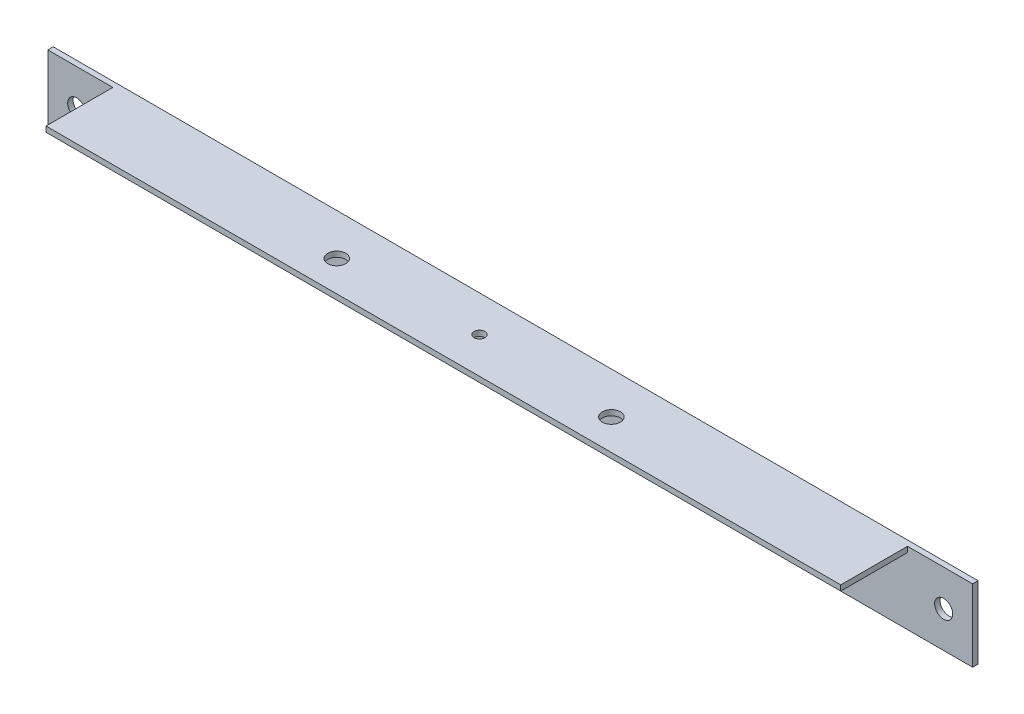
ISO-10303-21;
HEADER;
FILE_DESCRIPTION(('STEP AP214'),'2;1');
FILE_NAME('part.step','',(''),(''),'','','');
FILE_SCHEMA(('AUTOMOTIVE_DESIGN { 1 0 10303 214 1 1 1 1 }'));
ENDSEC;
DATA;
#1=APPLICATION_CONTEXT('core data for automotive mechanical design processes');
#2=APPLICATION_PROTOCOL_DEFINITION('international standard','automotive_design',2000,#1);
#3=PRODUCT_CONTEXT('',#1,'mechanical');
#4=PRODUCT('Part','Part','',(#3));
#5=PRODUCT_RELATED_PRODUCT_CATEGORY('part','',(#4));
#6=PRODUCT_DEFINITION_FORMATION('','',#4);
#7=PRODUCT_DEFINITION_CONTEXT('part definition',#1,'design');
#8=PRODUCT_DEFINITION('design','',#6,#7);
#9=PRODUCT_DEFINITION_SHAPE('','',#8);
#10=(LENGTH_UNIT() NAMED_UNIT(*) SI_UNIT(.MILLI.,.METRE.));
#11=(NAMED_UNIT(*) PLANE_ANGLE_UNIT() SI_UNIT($,.RADIAN.));
#12=(NAMED_UNIT(*) SI_UNIT($,.STERADIAN.) SOLID_ANGLE_UNIT());
#13=UNCERTAINTY_MEASURE_WITH_UNIT(LENGTH_MEASURE(1.E-05),#10,'distance_accuracy_value','');
#14=(GEOMETRIC_REPRESENTATION_CONTEXT(3) GLOBAL_UNCERTAINTY_ASSIGNED_CONTEXT((#13)) GLOBAL_UNIT_ASSIGNED_CONTEXT((#10,
#11,#12)) REPRESENTATION_CONTEXT('',''));
#15=CARTESIAN_POINT('',(0.,0.,0.));
#16=DIRECTION('',(0.,0.,1.));
#17=DIRECTION('',(1.,0.,0.));
#18=AXIS2_PLACEMENT_3D('',#15,#16,#17);
#19=CARTESIAN_POINT('',(128.,0.,1.5));
#20=DIRECTION('',(0.,0.,-1.));
#21=DIRECTION('',(0.,1.,0.));
#22=AXIS2_PLACEMENT_3D('',#19,#20,#21);
#23=PLANE('',#22);
#24=CARTESIAN_POINT('',(20.,-10.,1.5));
#25=DIRECTION('',(0.,0.,-1.));
#26=DIRECTION('',(0.,1.,0.));
#27=AXIS2_PLACEMENT_3D('',#24,#25,#26);
#28=CIRCLE('',#27,1.5);
#29=CARTESIAN_POINT('',(20.,-8.5,1.5));
#30=VERTEX_POINT('',#29);
#31=EDGE_CURVE('E226',#30,#30,#28,.T.);
#32=ORIENTED_EDGE('',*,*,#31,.T.);
#33=EDGE_LOOP('',(#32));
#34=FACE_BOUND('',#33,.T.);
#35=CARTESIAN_POINT('',(-20.,-10.,1.5));
#36=DIRECTION('',(0.,0.,-1.));
#37=DIRECTION('',(0.,1.,0.));
#38=AXIS2_PLACEMENT_3D('',#35,#36,#37);
#39=CIRCLE('',#38,1.5);
#40=CARTESIAN_POINT('',(-20.,-8.5,1.5));
#41=VERTEX_POINT('',#40);
#42=EDGE_CURVE('E229',#41,#41,#39,.T.);
#43=ORIENTED_EDGE('',*,*,#42,.T.);
#44=EDGE_LOOP('',(#43));
#45=FACE_BOUND('',#44,.T.);
#46=CARTESIAN_POINT('',(120.,-9.99999999999995,1.5));
#47=DIRECTION('',(0.,0.,1.));
#48=DIRECTION('',(-1.,0.,0.));
#49=AXIS2_PLACEMENT_3D('',#46,#47,#48);
#50=CIRCLE('',#49,2.5);
#51=CARTESIAN_POINT('',(117.5,-9.99999999999995,1.5));
#52=VERTEX_POINT('',#51);
#53=EDGE_CURVE('E145',#52,#52,#50,.T.);
#54=ORIENTED_EDGE('',*,*,#53,.F.);
#55=EDGE_LOOP('',(#54));
#56=FACE_BOUND('',#55,.T.);
#57=CARTESIAN_POINT('',(-120.,-9.99999999999995,1.5));
#58=DIRECTION('',(0.,0.,1.));
#59=DIRECTION('',(1.,0.,0.));
#60=AXIS2_PLACEMENT_3D('',#57,#58,#59);
#61=CIRCLE('',#60,2.5);
#62=CARTESIAN_POINT('',(-117.5,-9.99999999999995,1.5));
#63=VERTEX_POINT('',#62);
#64=EDGE_CURVE('E142',#63,#63,#61,.T.);
#65=ORIENTED_EDGE('',*,*,#64,.F.);
#66=EDGE_LOOP('',(#65));
#67=FACE_BOUND('',#66,.T.);
#68=DIRECTION('',(0.,-1.,0.));
#69=VECTOR('',#68,1.);
#70=CARTESIAN_POINT('',(-128.,0.,1.5));
#71=LINE('',#70,#69);
#72=CARTESIAN_POINT('',(-128.,0.,1.5));
#73=VERTEX_POINT('',#72);
#74=CARTESIAN_POINT('',(-128.,-20.,1.5));
#75=VERTEX_POINT('',#74);
#76=EDGE_CURVE('E48',#73,#75,#71,.T.);
#77=ORIENTED_EDGE('',*,*,#76,.T.);
#78=DIRECTION('',(-1.,0.,0.));
#79=VECTOR('',#78,1.);
#80=CARTESIAN_POINT('',(128.,-20.,1.5));
#81=LINE('',#80,#79);
#82=CARTESIAN_POINT('',(128.,-20.,1.5));
#83=VERTEX_POINT('',#82);
#84=EDGE_CURVE('E11',#83,#75,#81,.T.);
#85=ORIENTED_EDGE('',*,*,#84,.F.);
#86=DIRECTION('',(0.,-1.,0.));
#87=VECTOR('',#86,1.);
#88=CARTESIAN_POINT('',(128.,0.,1.5));
#89=LINE('',#88,#87);
#90=CARTESIAN_POINT('',(128.,0.,1.5));
#91=VERTEX_POINT('',#90);
#92=EDGE_CURVE('E77',#91,#83,#89,.T.);
#93=ORIENTED_EDGE('',*,*,#92,.F.);
#94=DIRECTION('',(-1.,0.,0.));
#95=VECTOR('',#94,1.);
#96=CARTESIAN_POINT('',(128.,0.,1.5));
#97=LINE('',#96,#95);
#98=CARTESIAN_POINT('',(110.,0.,1.5));
#99=VERTEX_POINT('',#98);
#100=EDGE_CURVE('E191',#91,#99,#97,.T.);
#101=ORIENTED_EDGE('',*,*,#100,.T.);
#102=DIRECTION('',(0.,-1.,0.));
#103=VECTOR('',#102,1.);
#104=CARTESIAN_POINT('',(110.,8.5,1.5));
#105=LINE('',#104,#103);
#106=CARTESIAN_POINT('',(110.,-1.5,1.5));
#107=VERTEX_POINT('',#106);
#108=EDGE_CURVE('E118',#99,#107,#105,.T.);
#109=ORIENTED_EDGE('',*,*,#108,.T.);
#110=DIRECTION('',(-1.,0.,0.));
#111=VECTOR('',#110,1.);
#112=CARTESIAN_POINT('',(128.,-1.5,1.5));
#113=LINE('',#112,#111);
#114=CARTESIAN_POINT('',(-110.,-1.5,1.5));
#115=VERTEX_POINT('',#114);
#116=EDGE_CURVE('E125',#107,#115,#113,.T.);
#117=ORIENTED_EDGE('',*,*,#116,.T.);
#118=DIRECTION('',(0.,-1.,0.));
#119=VECTOR('',#118,1.);
#120=CARTESIAN_POINT('',(-110.,8.5,1.5));
#121=LINE('',#120,#119);
#122=CARTESIAN_POINT('',(-110.,0.,1.5));
#123=VERTEX_POINT('',#122);
#124=EDGE_CURVE('E185',#123,#115,#121,.T.);
#125=ORIENTED_EDGE('',*,*,#124,.F.);
#126=DIRECTION('',(-1.,0.,0.));
#127=VECTOR('',#126,1.);
#128=CARTESIAN_POINT('',(128.,0.,1.5));
#129=LINE('',#128,#127);
#130=EDGE_CURVE('E183',#123,#73,#129,.T.);
#131=ORIENTED_EDGE('',*,*,#130,.T.);
#132=EDGE_LOOP('',(#77,#85,#93,#101,#109,#117,#125,#131));
#133=FACE_BOUND('',#132,.T.);
#134=ADVANCED_FACE('F32',(#34,#45,#56,#67,#133),#23,.F.);
#135=CARTESIAN_POINT('',(128.,-20.,0.));
#136=DIRECTION('',(0.,-1.,0.));
#137=DIRECTION('',(0.,0.,-1.));
#138=AXIS2_PLACEMENT_3D('',#135,#136,#137);
#139=PLANE('',#138);
#140=DIRECTION('',(0.,0.,1.));
#141=VECTOR('',#140,1.);
#142=CARTESIAN_POINT('',(-128.,-20.,0.));
#143=LINE('',#142,#141);
#144=CARTESIAN_POINT('',(-128.,-20.,0.));
#145=VERTEX_POINT('',#144);
#146=EDGE_CURVE('E169',#145,#75,#143,.T.);
#147=ORIENTED_EDGE('',*,*,#146,.F.);
#148=DIRECTION('',(-1.,0.,0.));
#149=VECTOR('',#148,1.);
#150=CARTESIAN_POINT('',(128.,-20.,0.));
#151=LINE('',#150,#149);
#152=CARTESIAN_POINT('',(128.,-20.,0.));
#153=VERTEX_POINT('',#152);
#154=EDGE_CURVE('E40',#153,#145,#151,.T.);
#155=ORIENTED_EDGE('',*,*,#154,.F.);
#156=DIRECTION('',(0.,0.,1.));
#157=VECTOR('',#156,1.);
#158=CARTESIAN_POINT('',(128.,-20.,0.));
#159=LINE('',#158,#157);
#160=EDGE_CURVE('E161',#153,#83,#159,.T.);
#161=ORIENTED_EDGE('',*,*,#160,.T.);
#162=ORIENTED_EDGE('',*,*,#84,.T.);
#163=EDGE_LOOP('',(#147,#155,#161,#162));
#164=FACE_BOUND('',#163,.T.);
#165=ADVANCED_FACE('F179',(#164),#139,.T.);
#166=CARTESIAN_POINT('',(128.,0.,0.));
#167=DIRECTION('',(0.,0.,-1.));
#168=DIRECTION('',(0.,1.,0.));
#169=AXIS2_PLACEMENT_3D('',#166,#167,#168);
#170=PLANE('',#169);
#171=CARTESIAN_POINT('',(20.,-10.,0.));
#172=DIRECTION('',(0.,0.,-1.));
#173=DIRECTION('',(0.,1.,0.));
#174=AXIS2_PLACEMENT_3D('',#171,#172,#173);
#175=CIRCLE('',#174,1.5);
#176=CARTESIAN_POINT('',(20.,-8.5,0.));
#177=VERTEX_POINT('',#176);
#178=EDGE_CURVE('E232',#177,#177,#175,.T.);
#179=ORIENTED_EDGE('',*,*,#178,.F.);
#180=EDGE_LOOP('',(#179));
#181=FACE_BOUND('',#180,.T.);
#182=CARTESIAN_POINT('',(-20.,-10.,0.));
#183=DIRECTION('',(0.,0.,-1.));
#184=DIRECTION('',(0.,-1.,0.));
#185=AXIS2_PLACEMENT_3D('',#182,#183,#184);
#186=CIRCLE('',#185,1.5);
#187=CARTESIAN_POINT('',(-20.,-11.5,0.));
#188=VERTEX_POINT('',#187);
#189=EDGE_CURVE('E233',#188,#188,#186,.T.);
#190=ORIENTED_EDGE('',*,*,#189,.F.);
#191=EDGE_LOOP('',(#190));
#192=FACE_BOUND('',#191,.T.);
#193=CARTESIAN_POINT('',(120.,-9.99999999999995,0.));
#194=DIRECTION('',(0.,0.,-1.));
#195=DIRECTION('',(0.,1.,0.));
#196=AXIS2_PLACEMENT_3D('',#193,#194,#195);
#197=CIRCLE('',#196,2.5);
#198=CARTESIAN_POINT('',(120.,-7.49999999999996,0.));
#199=VERTEX_POINT('',#198);
#200=EDGE_CURVE('E143',#199,#199,#197,.T.);
#201=ORIENTED_EDGE('',*,*,#200,.F.);
#202=EDGE_LOOP('',(#201));
#203=FACE_BOUND('',#202,.T.);
#204=CARTESIAN_POINT('',(-120.,-9.99999999999995,0.));
#205=DIRECTION('',(0.,0.,-1.));
#206=DIRECTION('',(0.,1.,0.));
#207=AXIS2_PLACEMENT_3D('',#204,#205,#206);
#208=CIRCLE('',#207,2.5);
#209=CARTESIAN_POINT('',(-120.,-7.49999999999996,0.));
#210=VERTEX_POINT('',#209);
#211=EDGE_CURVE('E140',#210,#210,#208,.T.);
#212=ORIENTED_EDGE('',*,*,#211,.F.);
#213=EDGE_LOOP('',(#212));
#214=FACE_BOUND('',#213,.T.);
#215=DIRECTION('',(0.,-1.,0.));
#216=VECTOR('',#215,1.);
#217=CARTESIAN_POINT('',(-128.,0.,0.));
#218=LINE('',#217,#216);
#219=CARTESIAN_POINT('',(-128.,0.,0.));
#220=VERTEX_POINT('',#219);
#221=EDGE_CURVE('E171',#220,#145,#218,.T.);
#222=ORIENTED_EDGE('',*,*,#221,.F.);
#223=DIRECTION('',(-1.,0.,0.));
#224=VECTOR('',#223,1.);
#225=CARTESIAN_POINT('',(128.,0.,0.));
#226=LINE('',#225,#224);
#227=CARTESIAN_POINT('',(128.,0.,0.));
#228=VERTEX_POINT('',#227);
#229=EDGE_CURVE('E133',#228,#220,#226,.T.);
#230=ORIENTED_EDGE('',*,*,#229,.F.);
#231=DIRECTION('',(0.,-1.,0.));
#232=VECTOR('',#231,1.);
#233=CARTESIAN_POINT('',(128.,0.,0.));
#234=LINE('',#233,#232);
#235=EDGE_CURVE('E164',#228,#153,#234,.T.);
#236=ORIENTED_EDGE('',*,*,#235,.T.);
#237=ORIENTED_EDGE('',*,*,#154,.T.);
#238=EDGE_LOOP('',(#222,#230,#236,#237));
#239=FACE_BOUND('',#238,.T.);
#240=ADVANCED_FACE('F176',(#181,#192,#203,#214,#239),#170,.T.);
#241=CARTESIAN_POINT('',(128.,0.,20.));
#242=DIRECTION('',(0.,1.,0.));
#243=DIRECTION('',(0.,0.,1.));
#244=AXIS2_PLACEMENT_3D('',#241,#242,#243);
#245=PLANE('',#244);
#246=CARTESIAN_POINT('',(0.,0.,10.));
#247=DIRECTION('',(0.,1.,0.));
#248=DIRECTION('',(0.,0.,1.));
#249=AXIS2_PLACEMENT_3D('',#246,#247,#248);
#250=CIRCLE('',#249,1.5);
#251=CARTESIAN_POINT('',(0.,0.,11.5));
#252=VERTEX_POINT('',#251);
#253=EDGE_CURVE('E223',#252,#252,#250,.T.);
#254=ORIENTED_EDGE('',*,*,#253,.F.);
#255=EDGE_LOOP('',(#254));
#256=FACE_BOUND('',#255,.T.);
#257=ORIENTED_EDGE('',*,*,#100,.F.);
#258=DIRECTION('',(0.,0.,-1.));
#259=VECTOR('',#258,1.);
#260=CARTESIAN_POINT('',(128.,0.,20.));
#261=LINE('',#260,#259);
#262=EDGE_CURVE('E57',#91,#228,#261,.T.);
#263=ORIENTED_EDGE('',*,*,#262,.T.);
#264=ORIENTED_EDGE('',*,*,#229,.T.);
#265=DIRECTION('',(0.,0.,-1.));
#266=VECTOR('',#265,1.);
#267=CARTESIAN_POINT('',(-128.,0.,20.));
#268=LINE('',#267,#266);
#269=EDGE_CURVE('E72',#73,#220,#268,.T.);
#270=ORIENTED_EDGE('',*,*,#269,.F.);
#271=ORIENTED_EDGE('',*,*,#130,.F.);
#272=DIRECTION('',(0.,0.,-1.));
#273=VECTOR('',#272,1.);
#274=CARTESIAN_POINT('',(-110.,0.,19.9999999999998));
#275=LINE('',#274,#273);
#276=CARTESIAN_POINT('',(-110.,0.,20.));
#277=VERTEX_POINT('',#276);
#278=EDGE_CURVE('E187',#277,#123,#275,.T.);
#279=ORIENTED_EDGE('',*,*,#278,.F.);
#280=DIRECTION('',(-1.,0.,0.));
#281=VECTOR('',#280,1.);
#282=CARTESIAN_POINT('',(128.,0.,20.));
#283=LINE('',#282,#281);
#284=CARTESIAN_POINT('',(110.,0.,20.));
#285=VERTEX_POINT('',#284);
#286=EDGE_CURVE('E131',#285,#277,#283,.T.);
#287=ORIENTED_EDGE('',*,*,#286,.F.);
#288=DIRECTION('',(0.,0.,1.));
#289=VECTOR('',#288,1.);
#290=CARTESIAN_POINT('',(110.,0.,20.));
#291=LINE('',#290,#289);
#292=EDGE_CURVE('E114',#99,#285,#291,.T.);
#293=ORIENTED_EDGE('',*,*,#292,.F.);
#294=EDGE_LOOP('',(#257,#263,#264,#270,#271,#279,#287,#293));
#295=FACE_BOUND('',#294,.T.);
#296=CARTESIAN_POINT('',(38.,0.,11.5));
#297=DIRECTION('',(0.,1.,0.));
#298=DIRECTION('',(0.,0.,1.));
#299=AXIS2_PLACEMENT_3D('',#296,#297,#298);
#300=CIRCLE('',#299,2.5);
#301=CARTESIAN_POINT('',(38.,0.,14.));
#302=VERTEX_POINT('',#301);
#303=EDGE_CURVE('E198',#302,#302,#300,.T.);
#304=ORIENTED_EDGE('',*,*,#303,.F.);
#305=EDGE_LOOP('',(#304));
#306=FACE_BOUND('',#305,.T.);
#307=CARTESIAN_POINT('',(-38.,0.,11.5));
#308=DIRECTION('',(0.,1.,0.));
#309=DIRECTION('',(0.,0.,1.));
#310=AXIS2_PLACEMENT_3D('',#307,#308,#309);
#311=CIRCLE('',#310,2.5);
#312=CARTESIAN_POINT('',(-38.,0.,14.));
#313=VERTEX_POINT('',#312);
#314=EDGE_CURVE('E151',#313,#313,#311,.T.);
#315=ORIENTED_EDGE('',*,*,#314,.F.);
#316=EDGE_LOOP('',(#315));
#317=FACE_BOUND('',#316,.T.);
#318=ADVANCED_FACE('F189',(#256,#295,#306,#317),#245,.T.);
#319=CARTESIAN_POINT('',(128.,-1.5,20.));
#320=DIRECTION('',(0.,0.,1.));
#321=DIRECTION('',(1.,0.,0.));
#322=AXIS2_PLACEMENT_3D('',#319,#320,#321);
#323=PLANE('',#322);
#324=DIRECTION('',(0.,-1.,0.));
#325=VECTOR('',#324,1.);
#326=CARTESIAN_POINT('',(110.,8.5,20.));
#327=LINE('',#326,#325);
#328=CARTESIAN_POINT('',(110.,-1.5,20.));
#329=VERTEX_POINT('',#328);
#330=EDGE_CURVE('E107',#285,#329,#327,.T.);
#331=ORIENTED_EDGE('',*,*,#330,.F.);
#332=ORIENTED_EDGE('',*,*,#286,.T.);
#333=DIRECTION('',(0.,-1.,0.));
#334=VECTOR('',#333,1.);
#335=CARTESIAN_POINT('',(-110.,8.5,20.));
#336=LINE('',#335,#334);
#337=CARTESIAN_POINT('',(-110.,-1.5,20.));
#338=VERTEX_POINT('',#337);
#339=EDGE_CURVE('E130',#277,#338,#336,.T.);
#340=ORIENTED_EDGE('',*,*,#339,.T.);
#341=DIRECTION('',(-1.,0.,0.));
#342=VECTOR('',#341,1.);
#343=CARTESIAN_POINT('',(128.,-1.5,20.));
#344=LINE('',#343,#342);
#345=EDGE_CURVE('E123',#329,#338,#344,.T.);
#346=ORIENTED_EDGE('',*,*,#345,.F.);
#347=EDGE_LOOP('',(#331,#332,#340,#346));
#348=FACE_BOUND('',#347,.T.);
#349=ADVANCED_FACE('F128',(#348),#323,.T.);
#350=CARTESIAN_POINT('',(128.,-1.5,20.));
#351=DIRECTION('',(0.,1.,0.));
#352=DIRECTION('',(0.,0.,1.));
#353=AXIS2_PLACEMENT_3D('',#350,#351,#352);
#354=PLANE('',#353);
#355=CARTESIAN_POINT('',(0.,-1.5,10.));
#356=DIRECTION('',(0.,1.,0.));
#357=DIRECTION('',(0.,0.,1.));
#358=AXIS2_PLACEMENT_3D('',#355,#356,#357);
#359=CIRCLE('',#358,1.5);
#360=CARTESIAN_POINT('',(0.,-1.5,11.5));
#361=VERTEX_POINT('',#360);
#362=EDGE_CURVE('E35',#361,#361,#359,.T.);
#363=ORIENTED_EDGE('',*,*,#362,.T.);
#364=EDGE_LOOP('',(#363));
#365=FACE_BOUND('',#364,.T.);
#366=CARTESIAN_POINT('',(38.,-1.5,11.5));
#367=DIRECTION('',(0.,-1.,0.));
#368=DIRECTION('',(0.,0.,1.));
#369=AXIS2_PLACEMENT_3D('',#366,#367,#368);
#370=CIRCLE('',#369,2.5);
#371=CARTESIAN_POINT('',(38.,-1.5,14.));
#372=VERTEX_POINT('',#371);
#373=EDGE_CURVE('E217',#372,#372,#370,.T.);
#374=ORIENTED_EDGE('',*,*,#373,.F.);
#375=EDGE_LOOP('',(#374));
#376=FACE_BOUND('',#375,.T.);
#377=CARTESIAN_POINT('',(-38.,-1.5,11.5));
#378=DIRECTION('',(0.,-1.,0.));
#379=DIRECTION('',(0.,0.,-1.));
#380=AXIS2_PLACEMENT_3D('',#377,#378,#379);
#381=CIRCLE('',#380,2.5);
#382=CARTESIAN_POINT('',(-38.,-1.5,9.));
#383=VERTEX_POINT('',#382);
#384=EDGE_CURVE('E156',#383,#383,#381,.T.);
#385=ORIENTED_EDGE('',*,*,#384,.F.);
#386=EDGE_LOOP('',(#385));
#387=FACE_BOUND('',#386,.T.);
#388=ORIENTED_EDGE('',*,*,#116,.F.);
#389=DIRECTION('',(0.,0.,-1.));
#390=VECTOR('',#389,1.);
#391=CARTESIAN_POINT('',(110.,-1.5,20.));
#392=LINE('',#391,#390);
#393=EDGE_CURVE('E111',#329,#107,#392,.T.);
#394=ORIENTED_EDGE('',*,*,#393,.F.);
#395=ORIENTED_EDGE('',*,*,#345,.T.);
#396=DIRECTION('',(0.,0.,1.));
#397=VECTOR('',#396,1.);
#398=CARTESIAN_POINT('',(-110.,-1.5,20.));
#399=LINE('',#398,#397);
#400=EDGE_CURVE('E213',#115,#338,#399,.T.);
#401=ORIENTED_EDGE('',*,*,#400,.F.);
#402=EDGE_LOOP('',(#388,#394,#395,#401));
#403=FACE_BOUND('',#402,.T.);
#404=ADVANCED_FACE('F121',(#365,#376,#387,#403),#354,.F.);
#405=CARTESIAN_POINT('',(128.,0.,0.));
#406=DIRECTION('',(-1.,0.,0.));
#407=DIRECTION('',(0.,0.,1.));
#408=AXIS2_PLACEMENT_3D('',#405,#406,#407);
#409=PLANE('',#408);
#410=ORIENTED_EDGE('',*,*,#262,.F.);
#411=ORIENTED_EDGE('',*,*,#92,.T.);
#412=ORIENTED_EDGE('',*,*,#160,.F.);
#413=ORIENTED_EDGE('',*,*,#235,.F.);
#414=EDGE_LOOP('',(#410,#411,#412,#413));
#415=FACE_BOUND('',#414,.T.);
#416=ADVANCED_FACE('F290',(#415),#409,.F.);
#417=CARTESIAN_POINT('',(-128.,0.,0.));
#418=DIRECTION('',(-1.,0.,0.));
#419=DIRECTION('',(0.,0.,1.));
#420=AXIS2_PLACEMENT_3D('',#417,#418,#419);
#421=PLANE('',#420);
#422=ORIENTED_EDGE('',*,*,#76,.F.);
#423=ORIENTED_EDGE('',*,*,#269,.T.);
#424=ORIENTED_EDGE('',*,*,#221,.T.);
#425=ORIENTED_EDGE('',*,*,#146,.T.);
#426=EDGE_LOOP('',(#422,#423,#424,#425));
#427=FACE_BOUND('',#426,.T.);
#428=ADVANCED_FACE('F173',(#427),#421,.T.);
#429=CARTESIAN_POINT('',(-120.,-9.99999999999995,-8.5));
#430=DIRECTION('',(0.,0.,1.));
#431=DIRECTION('',(1.,0.,0.));
#432=AXIS2_PLACEMENT_3D('',#429,#430,#431);
#433=CYLINDRICAL_SURFACE('',#432,2.5);
#434=ORIENTED_EDGE('',*,*,#211,.T.);
#435=EDGE_LOOP('',(#434));
#436=FACE_BOUND('',#435,.T.);
#437=ORIENTED_EDGE('',*,*,#64,.T.);
#438=EDGE_LOOP('',(#437));
#439=FACE_BOUND('',#438,.T.);
#440=ADVANCED_FACE('F250',(#436,#439),#433,.F.);
#441=CARTESIAN_POINT('',(120.,-9.99999999999995,-8.5));
#442=DIRECTION('',(0.,0.,1.));
#443=DIRECTION('',(1.,0.,0.));
#444=AXIS2_PLACEMENT_3D('',#441,#442,#443);
#445=CYLINDRICAL_SURFACE('',#444,2.5);
#446=ORIENTED_EDGE('',*,*,#200,.T.);
#447=EDGE_LOOP('',(#446));
#448=FACE_BOUND('',#447,.T.);
#449=ORIENTED_EDGE('',*,*,#53,.T.);
#450=EDGE_LOOP('',(#449));
#451=FACE_BOUND('',#450,.T.);
#452=ADVANCED_FACE('F205',(#448,#451),#445,.F.);
#453=CARTESIAN_POINT('',(-38.,8.5,11.5));
#454=DIRECTION('',(0.,-1.,0.));
#455=DIRECTION('',(0.,0.,-1.));
#456=AXIS2_PLACEMENT_3D('',#453,#454,#455);
#457=CYLINDRICAL_SURFACE('',#456,2.5);
#458=ORIENTED_EDGE('',*,*,#314,.T.);
#459=EDGE_LOOP('',(#458));
#460=FACE_BOUND('',#459,.T.);
#461=ORIENTED_EDGE('',*,*,#384,.T.);
#462=EDGE_LOOP('',(#461));
#463=FACE_BOUND('',#462,.T.);
#464=ADVANCED_FACE('F201',(#460,#463),#457,.F.);
#465=CARTESIAN_POINT('',(-110.,8.5,20.));
#466=DIRECTION('',(1.,0.,0.));
#467=DIRECTION('',(0.,0.,-1.));
#468=AXIS2_PLACEMENT_3D('',#465,#466,#467);
#469=PLANE('',#468);
#470=ORIENTED_EDGE('',*,*,#278,.T.);
#471=ORIENTED_EDGE('',*,*,#124,.T.);
#472=ORIENTED_EDGE('',*,*,#400,.T.);
#473=ORIENTED_EDGE('',*,*,#339,.F.);
#474=EDGE_LOOP('',(#470,#471,#472,#473));
#475=FACE_BOUND('',#474,.T.);
#476=ADVANCED_FACE('F204',(#475),#469,.F.);
#477=CARTESIAN_POINT('',(38.,8.5,11.5));
#478=DIRECTION('',(0.,-1.,0.));
#479=DIRECTION('',(0.,0.,-1.));
#480=AXIS2_PLACEMENT_3D('',#477,#478,#479);
#481=CYLINDRICAL_SURFACE('',#480,2.5);
#482=ORIENTED_EDGE('',*,*,#303,.T.);
#483=EDGE_LOOP('',(#482));
#484=FACE_BOUND('',#483,.T.);
#485=ORIENTED_EDGE('',*,*,#373,.T.);
#486=EDGE_LOOP('',(#485));
#487=FACE_BOUND('',#486,.T.);
#488=ADVANCED_FACE('F281',(#484,#487),#481,.F.);
#489=CARTESIAN_POINT('',(110.,8.5,20.));
#490=DIRECTION('',(-1.,0.,0.));
#491=DIRECTION('',(0.,0.,1.));
#492=AXIS2_PLACEMENT_3D('',#489,#490,#491);
#493=PLANE('',#492);
#494=ORIENTED_EDGE('',*,*,#292,.T.);
#495=ORIENTED_EDGE('',*,*,#330,.T.);
#496=ORIENTED_EDGE('',*,*,#393,.T.);
#497=ORIENTED_EDGE('',*,*,#108,.F.);
#498=EDGE_LOOP('',(#494,#495,#496,#497));
#499=FACE_BOUND('',#498,.T.);
#500=ADVANCED_FACE('F109',(#499),#493,.F.);
#501=CARTESIAN_POINT('',(0.,-5.,10.));
#502=DIRECTION('',(0.,1.,0.));
#503=DIRECTION('',(0.,0.,1.));
#504=AXIS2_PLACEMENT_3D('',#501,#502,#503);
#505=CYLINDRICAL_SURFACE('',#504,1.5);
#506=ORIENTED_EDGE('',*,*,#253,.T.);
#507=EDGE_LOOP('',(#506));
#508=FACE_BOUND('',#507,.T.);
#509=ORIENTED_EDGE('',*,*,#362,.F.);
#510=EDGE_LOOP('',(#509));
#511=FACE_BOUND('',#510,.T.);
#512=ADVANCED_FACE('F268',(#508,#511),#505,.F.);
#513=CARTESIAN_POINT('',(-20.,-10.,5.));
#514=DIRECTION('',(0.,0.,-1.));
#515=DIRECTION('',(0.,1.,0.));
#516=AXIS2_PLACEMENT_3D('',#513,#514,#515);
#517=CYLINDRICAL_SURFACE('',#516,1.5);
#518=ORIENTED_EDGE('',*,*,#189,.T.);
#519=EDGE_LOOP('',(#518));
#520=FACE_BOUND('',#519,.T.);
#521=ORIENTED_EDGE('',*,*,#42,.F.);
#522=EDGE_LOOP('',(#521));
#523=FACE_BOUND('',#522,.T.);
#524=ADVANCED_FACE('F266',(#520,#523),#517,.F.);
#525=CARTESIAN_POINT('',(20.,-10.,5.));
#526=DIRECTION('',(0.,0.,-1.));
#527=DIRECTION('',(0.,1.,0.));
#528=AXIS2_PLACEMENT_3D('',#525,#526,#527);
#529=CYLINDRICAL_SURFACE('',#528,1.5);
#530=ORIENTED_EDGE('',*,*,#178,.T.);
#531=EDGE_LOOP('',(#530));
#532=FACE_BOUND('',#531,.T.);
#533=ORIENTED_EDGE('',*,*,#31,.F.);
#534=EDGE_LOOP('',(#533));
#535=FACE_BOUND('',#534,.T.);
#536=ADVANCED_FACE('F239',(#532,#535),#529,.F.);
#537=CLOSED_SHELL('',(#134,#165,#240,#318,#349,#404,#416,#428,#440,#452,#464,#476,#488,#500,
#512,#524,#536));
#538=MANIFOLD_SOLID_BREP('B2',#537);
#539=ADVANCED_BREP_SHAPE_REPRESENTATION('',(#18,#538),#14);
#540=SHAPE_DEFINITION_REPRESENTATION(#9,#539);
ENDSEC;
END-ISO-10303-21;
